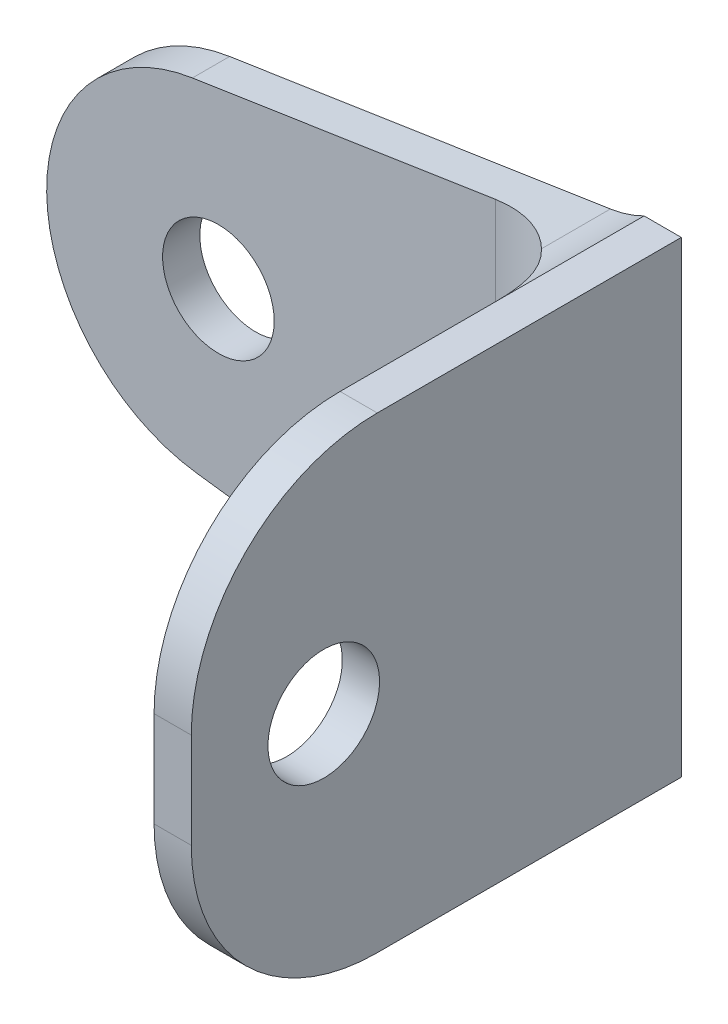
ISO-10303-21;
HEADER;
FILE_DESCRIPTION(('STEP AP214'),'2;1');
FILE_NAME('part.step','',(''),(''),'','','');
FILE_SCHEMA(('AUTOMOTIVE_DESIGN { 1 0 10303 214 1 1 1 1 }'));
ENDSEC;
DATA;
#1=APPLICATION_CONTEXT('core data for automotive mechanical design processes');
#2=APPLICATION_PROTOCOL_DEFINITION('international standard','automotive_design',2000,#1);
#3=PRODUCT_CONTEXT('',#1,'mechanical');
#4=PRODUCT('Part','Part','',(#3));
#5=PRODUCT_RELATED_PRODUCT_CATEGORY('part','',(#4));
#6=PRODUCT_DEFINITION_FORMATION('','',#4);
#7=PRODUCT_DEFINITION_CONTEXT('part definition',#1,'design');
#8=PRODUCT_DEFINITION('design','',#6,#7);
#9=PRODUCT_DEFINITION_SHAPE('','',#8);
#10=(LENGTH_UNIT() NAMED_UNIT(*) SI_UNIT(.MILLI.,.METRE.));
#11=(NAMED_UNIT(*) PLANE_ANGLE_UNIT() SI_UNIT($,.RADIAN.));
#12=(NAMED_UNIT(*) SI_UNIT($,.STERADIAN.) SOLID_ANGLE_UNIT());
#13=UNCERTAINTY_MEASURE_WITH_UNIT(LENGTH_MEASURE(1.E-05),#10,'distance_accuracy_value','');
#14=(GEOMETRIC_REPRESENTATION_CONTEXT(3) GLOBAL_UNCERTAINTY_ASSIGNED_CONTEXT((#13)) GLOBAL_UNIT_ASSIGNED_CONTEXT((#10,
#11,#12)) REPRESENTATION_CONTEXT('',''));
#15=CARTESIAN_POINT('',(0.,0.,0.));
#16=DIRECTION('',(0.,0.,1.));
#17=DIRECTION('',(1.,0.,0.));
#18=AXIS2_PLACEMENT_3D('',#15,#16,#17);
#19=CARTESIAN_POINT('',(274.999999999996,-59.9041243643724,2.));
#20=DIRECTION('',(0.151366741817184,-0.988477672722885,0.));
#21=DIRECTION('',(0.988477672722885,0.151366741817184,0.));
#22=AXIS2_PLACEMENT_3D('',#19,#20,#21);
#23=PLANE('',#22);
#24=CARTESIAN_POINT('',(266.999999999999,-61.1291737184983,8.));
#25=DIRECTION('',(0.151366741817184,-0.988477672722885,0.));
#26=DIRECTION('',(0.988477672722885,0.151366741817184,0.));
#27=AXIS2_PLACEMENT_3D('',#24,#25,#26);
#28=ELLIPSE('',#27,6.06993983331182,6.);
#29=CARTESIAN_POINT('',(266.999999999999,-61.1291737184983,2.));
#30=VERTEX_POINT('',#29);
#31=CARTESIAN_POINT('',(271.185710961045,-60.4882109048247,3.70118344767064));
#32=VERTEX_POINT('',#31);
#33=EDGE_CURVE('E58',#30,#32,#28,.T.);
#34=ORIENTED_EDGE('',*,*,#33,.T.);
#35=CARTESIAN_POINT('',(271.185710961045,-60.4882109048247,3.70118344767064));
#36=CARTESIAN_POINT('',(271.185710961045,-60.4882109048247,2.));
#37=B_SPLINE_CURVE_WITH_KNOTS('',1,(#35,#36),.UNSPECIFIED.,.F.,.F.,(2,2),(0.,1.),.UNSPECIFIED.);
#38=CARTESIAN_POINT('',(271.185710961045,-60.4882109048247,2.));
#39=VERTEX_POINT('',#38);
#40=EDGE_CURVE('E50',#32,#39,#37,.T.);
#41=ORIENTED_EDGE('',*,*,#40,.T.);
#42=DIRECTION('',(0.,0.,-1.));
#43=VECTOR('',#42,1.);
#44=CARTESIAN_POINT('',(271.185710961045,-60.4882109048247,2.00000000000002));
#45=LINE('',#44,#43);
#46=CARTESIAN_POINT('',(271.185710961045,-60.4882109048247,0.));
#47=VERTEX_POINT('',#46);
#48=EDGE_CURVE('E148',#39,#47,#45,.T.);
#49=ORIENTED_EDGE('',*,*,#48,.T.);
#50=DIRECTION('',(-0.988477672722884,-0.151366741817184,0.));
#51=VECTOR('',#50,1.);
#52=CARTESIAN_POINT('',(274.999999999996,-59.9041243643724,0.));
#53=LINE('',#52,#51);
#54=CARTESIAN_POINT('',(250.714866630847,-63.6229352329659,0.));
#55=VERTEX_POINT('',#54);
#56=EDGE_CURVE('E168',#47,#55,#53,.T.);
#57=ORIENTED_EDGE('',*,*,#56,.T.);
#58=DIRECTION('',(0.,0.,-1.));
#59=VECTOR('',#58,1.);
#60=CARTESIAN_POINT('',(250.714866630847,-63.6229352329659,2.));
#61=LINE('',#60,#59);
#62=CARTESIAN_POINT('',(250.714866630847,-63.6229352329659,2.));
#63=VERTEX_POINT('',#62);
#64=EDGE_CURVE('E191',#63,#55,#61,.T.);
#65=ORIENTED_EDGE('',*,*,#64,.F.);
#66=DIRECTION('',(-0.988477672722884,-0.151366741817184,0.));
#67=VECTOR('',#66,1.);
#68=CARTESIAN_POINT('',(274.999999999996,-59.9041243643724,2.));
#69=LINE('',#68,#67);
#70=EDGE_CURVE('E174',#30,#63,#69,.T.);
#71=ORIENTED_EDGE('',*,*,#70,.F.);
#72=EDGE_LOOP('',(#34,#41,#49,#57,#65,#71));
#73=FACE_BOUND('',#72,.T.);
#74=ADVANCED_FACE('F35',(#73),#23,.F.);
#75=CARTESIAN_POINT('',(250.920967809748,-81.9038233061181,2.));
#76=DIRECTION('',(0.129042640910157,0.991639045634515,0.));
#77=DIRECTION('',(-0.991639045634515,0.129042640910157,0.));
#78=AXIS2_PLACEMENT_3D('',#75,#76,#77);
#79=PLANE('',#78);
#80=DIRECTION('',(0.991639045634515,-0.129042640910157,0.));
#81=VECTOR('',#80,1.);
#82=CARTESIAN_POINT('',(250.920967809748,-81.9038233061181,0.));
#83=LINE('',#82,#81);
#84=CARTESIAN_POINT('',(250.920967809748,-81.9038233061181,0.));
#85=VERTEX_POINT('',#84);
#86=CARTESIAN_POINT('',(271.307050003365,-84.5566775837475,0.));
#87=VERTEX_POINT('',#86);
#88=EDGE_CURVE('E177',#85,#87,#83,.T.);
#89=ORIENTED_EDGE('',*,*,#88,.T.);
#90=DIRECTION('',(0.,0.,1.));
#91=VECTOR('',#90,1.);
#92=CARTESIAN_POINT('',(271.307050003365,-84.5566775837475,2.));
#93=LINE('',#92,#91);
#94=CARTESIAN_POINT('',(271.307050003365,-84.5566775837475,2.));
#95=VERTEX_POINT('',#94);
#96=EDGE_CURVE('E143',#87,#95,#93,.T.);
#97=ORIENTED_EDGE('',*,*,#96,.T.);
#98=CARTESIAN_POINT('',(271.307050003365,-84.5566775837475,2.));
#99=CARTESIAN_POINT('',(271.307050003365,-84.5566775837475,3.82276164571552));
#100=B_SPLINE_CURVE_WITH_KNOTS('',1,(#98,#99),.UNSPECIFIED.,.F.,.F.,(2,2),(0.,1.),.UNSPECIFIED.);
#101=CARTESIAN_POINT('',(271.307050003365,-84.5566775837475,3.82276164571552));
#102=VERTEX_POINT('',#101);
#103=EDGE_CURVE('E66',#95,#102,#100,.T.);
#104=ORIENTED_EDGE('',*,*,#103,.T.);
#105=CARTESIAN_POINT('',(266.999999999999,-83.9961983353625,8.));
#106=DIRECTION('',(0.129042640910157,0.991639045634515,0.));
#107=DIRECTION('',(-0.991639045634515,0.129042640910157,0.));
#108=AXIS2_PLACEMENT_3D('',#105,#106,#107);
#109=ELLIPSE('',#108,6.05058869597133,6.);
#110=CARTESIAN_POINT('',(266.999999999999,-83.9961983353625,2.));
#111=VERTEX_POINT('',#110);
#112=EDGE_CURVE('E247',#102,#111,#109,.T.);
#113=ORIENTED_EDGE('',*,*,#112,.T.);
#114=DIRECTION('',(0.991639045634515,-0.129042640910157,0.));
#115=VECTOR('',#114,1.);
#116=CARTESIAN_POINT('',(250.920967809748,-81.9038233061181,2.));
#117=LINE('',#116,#115);
#118=CARTESIAN_POINT('',(250.920967809748,-81.9038233061181,2.));
#119=VERTEX_POINT('',#118);
#120=EDGE_CURVE('E179',#119,#111,#117,.T.);
#121=ORIENTED_EDGE('',*,*,#120,.F.);
#122=DIRECTION('',(0.,0.,-1.));
#123=VECTOR('',#122,1.);
#124=CARTESIAN_POINT('',(250.920967809748,-81.9038233061181,2.));
#125=LINE('',#124,#123);
#126=EDGE_CURVE('E188',#119,#85,#125,.T.);
#127=ORIENTED_EDGE('',*,*,#126,.T.);
#128=EDGE_LOOP('',(#89,#97,#104,#113,#121,#127));
#129=FACE_BOUND('',#128,.T.);
#130=ADVANCED_FACE('F224',(#129),#79,.F.);
#131=CARTESIAN_POINT('',(252.112318831267,-72.7487860125337,2.));
#132=DIRECTION('',(0.,0.,1.));
#133=DIRECTION('',(1.,0.,0.));
#134=AXIS2_PLACEMENT_3D('',#131,#132,#133);
#135=PLANE('',#134);
#136=CARTESIAN_POINT('',(252.112318831267,-72.7487860125337,2.));
#137=DIRECTION('',(0.,0.,1.));
#138=DIRECTION('',(1.,0.,0.));
#139=AXIS2_PLACEMENT_3D('',#136,#137,#138);
#140=CIRCLE('',#139,2.99999999999999);
#141=CARTESIAN_POINT('',(255.112318831267,-72.7487860125337,2.));
#142=VERTEX_POINT('',#141);
#143=EDGE_CURVE('E337',#142,#142,#140,.T.);
#144=ORIENTED_EDGE('',*,*,#143,.F.);
#145=EDGE_LOOP('',(#144));
#146=FACE_BOUND('',#145,.T.);
#147=ORIENTED_EDGE('',*,*,#120,.T.);
#148=DIRECTION('',(0.,1.,0.));
#149=VECTOR('',#148,1.);
#150=CARTESIAN_POINT('',(266.999999999999,-72.7487860125337,2.));
#151=LINE('',#150,#149);
#152=EDGE_CURVE('E217',#111,#30,#151,.T.);
#153=ORIENTED_EDGE('',*,*,#152,.T.);
#154=ORIENTED_EDGE('',*,*,#70,.T.);
#155=CARTESIAN_POINT('',(252.112318831267,-72.7487860125337,2.));
#156=DIRECTION('',(0.,0.,1.));
#157=DIRECTION('',(1.,0.,0.));
#158=AXIS2_PLACEMENT_3D('',#155,#156,#157);
#159=CIRCLE('',#158,9.23222752662634);
#160=EDGE_CURVE('E176',#63,#119,#159,.T.);
#161=ORIENTED_EDGE('',*,*,#160,.T.);
#162=EDGE_LOOP('',(#147,#153,#154,#161));
#163=FACE_BOUND('',#162,.T.);
#164=ADVANCED_FACE('F234',(#146,#163),#135,.T.);
#165=CARTESIAN_POINT('',(274.999999999996,-85.0372435945478,2.));
#166=DIRECTION('',(-1.,0.,0.));
#167=DIRECTION('',(0.,0.,1.));
#168=AXIS2_PLACEMENT_3D('',#165,#166,#167);
#169=PLANE('',#168);
#170=CARTESIAN_POINT('',(274.999999999996,-72.4706839794601,19.2241169072921));
#171=DIRECTION('',(-1.,0.,0.));
#172=DIRECTION('',(0.,0.,1.));
#173=AXIS2_PLACEMENT_3D('',#170,#171,#172);
#174=CIRCLE('',#173,3.);
#175=CARTESIAN_POINT('',(274.999999999996,-72.4706839794601,22.2241169072921));
#176=VERTEX_POINT('',#175);
#177=EDGE_CURVE('E338',#176,#176,#174,.F.);
#178=ORIENTED_EDGE('',*,*,#177,.F.);
#179=EDGE_LOOP('',(#178));
#180=FACE_BOUND('',#179,.T.);
#181=DIRECTION('',(0.,0.,-1.));
#182=VECTOR('',#181,1.);
#183=CARTESIAN_POINT('',(274.999999999996,-59.9041243643724,2.));
#184=LINE('',#183,#182);
#185=CARTESIAN_POINT('',(274.999999999996,-59.9041243643724,16.3463061986581));
#186=VERTEX_POINT('',#185);
#187=CARTESIAN_POINT('',(274.999999999996,-59.9041243643724,0.));
#188=VERTEX_POINT('',#187);
#189=EDGE_CURVE('E194',#186,#188,#184,.T.);
#190=ORIENTED_EDGE('',*,*,#189,.F.);
#191=CARTESIAN_POINT('',(274.999999999996,-69.904124364372,16.3463061986584));
#192=DIRECTION('',(-1.,0.,0.));
#193=DIRECTION('',(0.,0.,1.));
#194=AXIS2_PLACEMENT_3D('',#191,#192,#193);
#195=CIRCLE('',#194,10.);
#196=CARTESIAN_POINT('',(274.999999999999,-69.904124364372,26.3463061986584));
#197=VERTEX_POINT('',#196);
#198=EDGE_CURVE('E201',#186,#197,#195,.F.);
#199=ORIENTED_EDGE('',*,*,#198,.T.);
#200=DIRECTION('',(0.,1.,0.));
#201=VECTOR('',#200,1.);
#202=CARTESIAN_POINT('',(274.999999999999,-59.9041243643724,26.3463061986584));
#203=LINE('',#202,#201);
#204=CARTESIAN_POINT('',(274.999999999999,-75.0372435945478,26.3463061986584));
#205=VERTEX_POINT('',#204);
#206=EDGE_CURVE('E300',#205,#197,#203,.T.);
#207=ORIENTED_EDGE('',*,*,#206,.F.);
#208=CARTESIAN_POINT('',(274.999999999996,-75.0372435945478,16.3463061986584));
#209=DIRECTION('',(-1.,0.,0.));
#210=DIRECTION('',(0.,0.,1.));
#211=AXIS2_PLACEMENT_3D('',#208,#209,#210);
#212=CIRCLE('',#211,10.);
#213=CARTESIAN_POINT('',(274.999999999996,-85.0372435945478,16.3463061986584));
#214=VERTEX_POINT('',#213);
#215=EDGE_CURVE('E199',#205,#214,#212,.F.);
#216=ORIENTED_EDGE('',*,*,#215,.T.);
#217=DIRECTION('',(0.,0.,-1.));
#218=VECTOR('',#217,1.);
#219=CARTESIAN_POINT('',(274.999999999996,-85.0372435945478,2.));
#220=LINE('',#219,#218);
#221=CARTESIAN_POINT('',(274.999999999996,-85.0372435945478,0.));
#222=VERTEX_POINT('',#221);
#223=EDGE_CURVE('E181',#214,#222,#220,.T.);
#224=ORIENTED_EDGE('',*,*,#223,.T.);
#225=DIRECTION('',(0.,1.,0.));
#226=VECTOR('',#225,1.);
#227=CARTESIAN_POINT('',(274.999999999996,-85.0372435945478,0.));
#228=LINE('',#227,#226);
#229=EDGE_CURVE('E165',#222,#188,#228,.T.);
#230=ORIENTED_EDGE('',*,*,#229,.T.);
#231=EDGE_LOOP('',(#190,#199,#207,#216,#224,#230));
#232=FACE_BOUND('',#231,.T.);
#233=ADVANCED_FACE('F239',(#180,#232),#169,.F.);
#234=CARTESIAN_POINT('',(252.112318831267,-72.7487860125337,2.));
#235=DIRECTION('',(0.,0.,-1.));
#236=DIRECTION('',(-1.,0.,0.));
#237=AXIS2_PLACEMENT_3D('',#234,#235,#236);
#238=CYLINDRICAL_SURFACE('',#237,9.23222752662634);
#239=CARTESIAN_POINT('',(252.112318831267,-72.7487860125337,0.));
#240=DIRECTION('',(0.,0.,1.));
#241=DIRECTION('',(1.,0.,0.));
#242=AXIS2_PLACEMENT_3D('',#239,#240,#241);
#243=CIRCLE('',#242,9.23222752662634);
#244=EDGE_CURVE('E184',#55,#85,#243,.T.);
#245=ORIENTED_EDGE('',*,*,#244,.T.);
#246=ORIENTED_EDGE('',*,*,#126,.F.);
#247=ORIENTED_EDGE('',*,*,#160,.F.);
#248=ORIENTED_EDGE('',*,*,#64,.T.);
#249=EDGE_LOOP('',(#245,#246,#247,#248));
#250=FACE_BOUND('',#249,.T.);
#251=ADVANCED_FACE('F236',(#250),#238,.T.);
#252=CARTESIAN_POINT('',(252.112318831267,-72.7487860125337,0.));
#253=DIRECTION('',(0.,0.,1.));
#254=DIRECTION('',(1.,0.,0.));
#255=AXIS2_PLACEMENT_3D('',#252,#253,#254);
#256=PLANE('',#255);
#257=CARTESIAN_POINT('',(252.112318831267,-72.7487860125337,0.));
#258=DIRECTION('',(0.,0.,1.));
#259=DIRECTION('',(1.,0.,0.));
#260=AXIS2_PLACEMENT_3D('',#257,#258,#259);
#261=CIRCLE('',#260,2.99999999999999);
#262=CARTESIAN_POINT('',(255.112318831267,-72.7487860125337,0.));
#263=VERTEX_POINT('',#262);
#264=EDGE_CURVE('E258',#263,#263,#261,.F.);
#265=ORIENTED_EDGE('',*,*,#264,.F.);
#266=EDGE_LOOP('',(#265));
#267=FACE_BOUND('',#266,.T.);
#268=ORIENTED_EDGE('',*,*,#229,.F.);
#269=DIRECTION('',(1.,0.,0.));
#270=VECTOR('',#269,1.);
#271=CARTESIAN_POINT('',(272.999999999999,-85.0372435945478,0.));
#272=LINE('',#271,#270);
#273=CARTESIAN_POINT('',(272.999999999999,-85.0372435945478,0.));
#274=VERTEX_POINT('',#273);
#275=EDGE_CURVE('E155',#274,#222,#272,.T.);
#276=ORIENTED_EDGE('',*,*,#275,.F.);
#277=CARTESIAN_POINT('',(270.532794157904,-90.5065118575546,0.));
#278=DIRECTION('',(0.,0.,1.));
#279=DIRECTION('',(1.,0.,0.));
#280=AXIS2_PLACEMENT_3D('',#277,#278,#279);
#281=CIRCLE('',#280,6.);
#282=EDGE_CURVE('E138',#274,#87,#281,.T.);
#283=ORIENTED_EDGE('',*,*,#282,.T.);
#284=ORIENTED_EDGE('',*,*,#88,.F.);
#285=ORIENTED_EDGE('',*,*,#244,.F.);
#286=ORIENTED_EDGE('',*,*,#56,.F.);
#287=CARTESIAN_POINT('',(270.277510510142,-54.5573448684874,0.));
#288=DIRECTION('',(0.,0.,1.));
#289=DIRECTION('',(1.,0.,0.));
#290=AXIS2_PLACEMENT_3D('',#287,#288,#289);
#291=CIRCLE('',#290,6.);
#292=CARTESIAN_POINT('',(272.999999999999,-59.9041243643724,0.));
#293=VERTEX_POINT('',#292);
#294=EDGE_CURVE('E11',#47,#293,#291,.T.);
#295=ORIENTED_EDGE('',*,*,#294,.T.);
#296=DIRECTION('',(1.,0.,0.));
#297=VECTOR('',#296,1.);
#298=CARTESIAN_POINT('',(272.999999999999,-59.9041243643724,0.));
#299=LINE('',#298,#297);
#300=EDGE_CURVE('E166',#293,#188,#299,.T.);
#301=ORIENTED_EDGE('',*,*,#300,.T.);
#302=EDGE_LOOP('',(#268,#276,#283,#284,#285,#286,#295,#301));
#303=FACE_BOUND('',#302,.T.);
#304=ADVANCED_FACE('F162',(#267,#303),#256,.F.);
#305=CARTESIAN_POINT('',(272.999999999999,0.,0.));
#306=DIRECTION('',(1.,0.,0.));
#307=DIRECTION('',(0.,0.,-1.));
#308=AXIS2_PLACEMENT_3D('',#305,#306,#307);
#309=PLANE('',#308);
#310=CARTESIAN_POINT('',(272.999999999999,-72.4706839794601,19.2241169072921));
#311=DIRECTION('',(-1.,0.,0.));
#312=DIRECTION('',(0.,0.,1.));
#313=AXIS2_PLACEMENT_3D('',#310,#311,#312);
#314=CIRCLE('',#313,3.);
#315=CARTESIAN_POINT('',(272.999999999999,-72.4706839794601,22.2241169072921));
#316=VERTEX_POINT('',#315);
#317=EDGE_CURVE('E343',#316,#316,#314,.T.);
#318=ORIENTED_EDGE('',*,*,#317,.F.);
#319=EDGE_LOOP('',(#318));
#320=FACE_BOUND('',#319,.T.);
#321=DIRECTION('',(0.,0.,-1.));
#322=VECTOR('',#321,1.);
#323=CARTESIAN_POINT('',(272.999999999999,-59.9041243643724,2.));
#324=LINE('',#323,#322);
#325=CARTESIAN_POINT('',(272.999999999999,-59.9041243643724,16.3463061986581));
#326=VERTEX_POINT('',#325);
#327=CARTESIAN_POINT('',(272.999999999999,-59.9041243643724,8.));
#328=VERTEX_POINT('',#327);
#329=EDGE_CURVE('E170',#326,#328,#324,.T.);
#330=ORIENTED_EDGE('',*,*,#329,.T.);
#331=DIRECTION('',(0.,1.,0.));
#332=VECTOR('',#331,1.);
#333=CARTESIAN_POINT('',(272.999999999999,0.,8.));
#334=LINE('',#333,#332);
#335=CARTESIAN_POINT('',(272.999999999999,-85.0372435945478,8.));
#336=VERTEX_POINT('',#335);
#337=EDGE_CURVE('E214',#328,#336,#334,.F.);
#338=ORIENTED_EDGE('',*,*,#337,.T.);
#339=DIRECTION('',(0.,0.,1.));
#340=VECTOR('',#339,1.);
#341=CARTESIAN_POINT('',(272.999999999999,-85.0372435945478,26.3463061986584));
#342=LINE('',#341,#340);
#343=CARTESIAN_POINT('',(272.999999999999,-85.0372435945478,16.3463061986584));
#344=VERTEX_POINT('',#343);
#345=EDGE_CURVE('E157',#336,#344,#342,.T.);
#346=ORIENTED_EDGE('',*,*,#345,.T.);
#347=CARTESIAN_POINT('',(272.999999999999,-75.0372435945478,16.3463061986584));
#348=DIRECTION('',(1.,0.,0.));
#349=DIRECTION('',(0.,0.,-1.));
#350=AXIS2_PLACEMENT_3D('',#347,#348,#349);
#351=CIRCLE('',#350,10.);
#352=CARTESIAN_POINT('',(272.999999999999,-75.0372435945478,26.3463061986584));
#353=VERTEX_POINT('',#352);
#354=EDGE_CURVE('E208',#344,#353,#351,.F.);
#355=ORIENTED_EDGE('',*,*,#354,.T.);
#356=DIRECTION('',(0.,1.,0.));
#357=VECTOR('',#356,1.);
#358=CARTESIAN_POINT('',(272.999999999999,-59.9041243643724,26.3463061986584));
#359=LINE('',#358,#357);
#360=CARTESIAN_POINT('',(272.999999999999,-69.904124364372,26.3463061986584));
#361=VERTEX_POINT('',#360);
#362=EDGE_CURVE('E159',#353,#361,#359,.T.);
#363=ORIENTED_EDGE('',*,*,#362,.T.);
#364=CARTESIAN_POINT('',(272.999999999999,-69.904124364372,16.3463061986584));
#365=DIRECTION('',(1.,0.,0.));
#366=DIRECTION('',(0.,0.,-1.));
#367=AXIS2_PLACEMENT_3D('',#364,#365,#366);
#368=CIRCLE('',#367,10.);
#369=EDGE_CURVE('E210',#361,#326,#368,.F.);
#370=ORIENTED_EDGE('',*,*,#369,.T.);
#371=EDGE_LOOP('',(#330,#338,#346,#355,#363,#370));
#372=FACE_BOUND('',#371,.T.);
#373=ADVANCED_FACE('F306',(#320,#372),#309,.F.);
#374=CARTESIAN_POINT('',(272.999999999999,-85.0372435945478,26.3463061986584));
#375=DIRECTION('',(0.,1.,0.));
#376=DIRECTION('',(0.,0.,1.));
#377=AXIS2_PLACEMENT_3D('',#374,#375,#376);
#378=PLANE('',#377);
#379=ORIENTED_EDGE('',*,*,#223,.F.);
#380=DIRECTION('',(1.,0.,0.));
#381=VECTOR('',#380,1.);
#382=CARTESIAN_POINT('',(272.999999999999,-85.0372435945478,16.3463061986584));
#383=LINE('',#382,#381);
#384=EDGE_CURVE('E212',#214,#344,#383,.F.);
#385=ORIENTED_EDGE('',*,*,#384,.T.);
#386=ORIENTED_EDGE('',*,*,#345,.F.);
#387=EDGE_CURVE('E142',#274,#336,#342,.T.);
#388=ORIENTED_EDGE('',*,*,#387,.F.);
#389=ORIENTED_EDGE('',*,*,#275,.T.);
#390=EDGE_LOOP('',(#379,#385,#386,#388,#389));
#391=FACE_BOUND('',#390,.T.);
#392=ADVANCED_FACE('F154',(#391),#378,.F.);
#393=CARTESIAN_POINT('',(272.999999999999,-59.9041243643724,26.3463061986584));
#394=DIRECTION('',(0.,0.,-1.));
#395=DIRECTION('',(0.,1.,0.));
#396=AXIS2_PLACEMENT_3D('',#393,#394,#395);
#397=PLANE('',#396);
#398=ORIENTED_EDGE('',*,*,#206,.T.);
#399=DIRECTION('',(1.,0.,0.));
#400=VECTOR('',#399,1.);
#401=CARTESIAN_POINT('',(272.999999999999,-69.904124364372,26.3463061986584));
#402=LINE('',#401,#400);
#403=EDGE_CURVE('E206',#197,#361,#402,.F.);
#404=ORIENTED_EDGE('',*,*,#403,.T.);
#405=ORIENTED_EDGE('',*,*,#362,.F.);
#406=DIRECTION('',(1.,0.,0.));
#407=VECTOR('',#406,1.);
#408=CARTESIAN_POINT('',(272.999999999999,-75.0372435945478,26.3463061986584));
#409=LINE('',#408,#407);
#410=EDGE_CURVE('E203',#353,#205,#409,.T.);
#411=ORIENTED_EDGE('',*,*,#410,.T.);
#412=EDGE_LOOP('',(#398,#404,#405,#411));
#413=FACE_BOUND('',#412,.T.);
#414=ADVANCED_FACE('F319',(#413),#397,.F.);
#415=CARTESIAN_POINT('',(272.999999999999,-59.9041243643724,0.));
#416=DIRECTION('',(0.,-1.,0.));
#417=DIRECTION('',(0.,0.,-1.));
#418=AXIS2_PLACEMENT_3D('',#415,#416,#417);
#419=PLANE('',#418);
#420=ORIENTED_EDGE('',*,*,#329,.F.);
#421=DIRECTION('',(1.,0.,0.));
#422=VECTOR('',#421,1.);
#423=CARTESIAN_POINT('',(272.999999999999,-59.904124364372,16.3463061986581));
#424=LINE('',#423,#422);
#425=EDGE_CURVE('E196',#326,#186,#424,.T.);
#426=ORIENTED_EDGE('',*,*,#425,.T.);
#427=ORIENTED_EDGE('',*,*,#189,.T.);
#428=ORIENTED_EDGE('',*,*,#300,.F.);
#429=EDGE_CURVE('E292',#328,#293,#324,.T.);
#430=ORIENTED_EDGE('',*,*,#429,.F.);
#431=EDGE_LOOP('',(#420,#426,#427,#428,#430));
#432=FACE_BOUND('',#431,.T.);
#433=ADVANCED_FACE('F309',(#432),#419,.F.);
#434=CARTESIAN_POINT('',(272.999999999999,-69.904124364372,16.3463061986584));
#435=DIRECTION('',(1.,0.,0.));
#436=DIRECTION('',(0.,0.,-1.));
#437=AXIS2_PLACEMENT_3D('',#434,#435,#436);
#438=CYLINDRICAL_SURFACE('',#437,10.);
#439=ORIENTED_EDGE('',*,*,#369,.F.);
#440=ORIENTED_EDGE('',*,*,#403,.F.);
#441=ORIENTED_EDGE('',*,*,#198,.F.);
#442=ORIENTED_EDGE('',*,*,#425,.F.);
#443=EDGE_LOOP('',(#439,#440,#441,#442));
#444=FACE_BOUND('',#443,.T.);
#445=ADVANCED_FACE('F312',(#444),#438,.T.);
#446=CARTESIAN_POINT('',(272.999999999999,-75.0372435945478,16.3463061986584));
#447=DIRECTION('',(1.,0.,0.));
#448=DIRECTION('',(0.,0.,-1.));
#449=AXIS2_PLACEMENT_3D('',#446,#447,#448);
#450=CYLINDRICAL_SURFACE('',#449,10.);
#451=ORIENTED_EDGE('',*,*,#354,.F.);
#452=ORIENTED_EDGE('',*,*,#384,.F.);
#453=ORIENTED_EDGE('',*,*,#215,.F.);
#454=ORIENTED_EDGE('',*,*,#410,.F.);
#455=EDGE_LOOP('',(#451,#452,#453,#454));
#456=FACE_BOUND('',#455,.T.);
#457=ADVANCED_FACE('F276',(#456),#450,.T.);
#458=CARTESIAN_POINT('',(270.277510510142,-54.5573448684874,1.67070185104649E-12));
#459=DIRECTION('',(0.,0.,-1.));
#460=DIRECTION('',(0.,1.,0.));
#461=AXIS2_PLACEMENT_3D('',#458,#459,#460);
#462=CYLINDRICAL_SURFACE('',#461,6.);
#463=ORIENTED_EDGE('',*,*,#48,.F.);
#464=ORIENTED_EDGE('',*,*,#40,.F.);
#465=CARTESIAN_POINT('',(271.185710961045,-60.4882109048247,3.70118344767064));
#466=CARTESIAN_POINT('',(271.307077092016,-60.4696251202195,3.81934730652606));
#467=CARTESIAN_POINT('',(271.423148342147,-60.4480396354115,3.94238430471244));
#468=CARTESIAN_POINT('',(271.644115634312,-60.4007301818852,4.19728974740231));
#469=CARTESIAN_POINT('',(271.749016560275,-60.3750080342651,4.32915429088004));
#470=CARTESIAN_POINT('',(271.94759161841,-60.321150968183,4.60148997818437));
#471=CARTESIAN_POINT('',(272.041215495021,-60.2930061430502,4.74199571730797));
#472=CARTESIAN_POINT('',(272.216263557097,-60.2362271469522,5.03031422172973));
#473=CARTESIAN_POINT('',(272.297687917737,-60.2075929830203,5.17812688206511));
#474=CARTESIAN_POINT('',(272.447929548041,-60.1516021426312,5.48036534512396));
#475=CARTESIAN_POINT('',(272.51674002719,-60.1242461601357,5.63479465496873));
#476=CARTESIAN_POINT('',(272.641195442764,-60.0725543220207,5.94927100872174));
#477=CARTESIAN_POINT('',(272.696847685907,-60.0482167938519,6.10931487791465));
#478=CARTESIAN_POINT('',(272.794386139038,-60.0041967987376,6.43358438410293));
#479=CARTESIAN_POINT('',(272.83631781963,-59.984499017525,6.59779422434116));
#480=CARTESIAN_POINT('',(272.906195789777,-59.9510003312781,6.92968193208134));
#481=CARTESIAN_POINT('',(272.934150428869,-59.9371959064214,7.09735766664735));
#482=CARTESIAN_POINT('',(272.969926908594,-59.9193574839575,7.38764972174313));
#483=CARTESIAN_POINT('',(272.981192973556,-59.9136706329857,7.50975120714105));
#484=CARTESIAN_POINT('',(272.996234301951,-59.9060417744893,7.75456144595878));
#485=CARTESIAN_POINT('',(273.00000764618,-59.9041007264273,7.87727034689677));
#486=CARTESIAN_POINT('',(272.999999999999,-59.9041243643722,7.99999999999998));
#487=B_SPLINE_CURVE_WITH_KNOTS('',3,(#465,#466,#467,#468,#469,#470,#471,#472,#473,#474,#475,
#476,#477,#478,#479,#480,#481,#482,#483,#484,#485,#486),.UNSPECIFIED.,.F.,.F.,(4,2,2,2,2,2,2,2,
2,2,4),(0.,0.510946608924026,1.02166889462449,1.53458900112562,2.04750174174872,2.5606897963944,
3.07359220686553,3.58477720038263,4.09565645874729,4.46363932870201,4.83171644253414),.UNSPECIFIED.);
#488=EDGE_CURVE('E40',#328,#32,#487,.F.);
#489=ORIENTED_EDGE('',*,*,#488,.F.);
#490=ORIENTED_EDGE('',*,*,#429,.T.);
#491=ORIENTED_EDGE('',*,*,#294,.F.);
#492=EDGE_LOOP('',(#463,#464,#489,#490,#491));
#493=FACE_BOUND('',#492,.T.);
#494=ADVANCED_FACE('F37',(#493),#462,.F.);
#495=CARTESIAN_POINT('',(266.999999999999,-72.7487860125337,8.));
#496=DIRECTION('',(0.,1.,0.));
#497=DIRECTION('',(0.,0.,1.));
#498=AXIS2_PLACEMENT_3D('',#495,#496,#497);
#499=CYLINDRICAL_SURFACE('',#498,6.);
#500=ORIENTED_EDGE('',*,*,#152,.F.);
#501=ORIENTED_EDGE('',*,*,#112,.F.);
#502=CARTESIAN_POINT('',(271.307050003365,-84.5566775837475,3.82276164571552));
#503=CARTESIAN_POINT('',(271.424642674542,-84.5719838862058,3.94399656631268));
#504=CARTESIAN_POINT('',(271.536884566479,-84.5901310674916,4.06998078620677));
#505=CARTESIAN_POINT('',(271.750076550608,-84.6302889115934,4.33052230707429));
#506=CARTESIAN_POINT('',(271.851030812899,-84.6522981398436,4.46507641296336));
#507=CARTESIAN_POINT('',(272.041518455751,-84.6984662777388,4.74246677835418));
#508=CARTESIAN_POINT('',(272.131005445227,-84.7226332872515,4.8853334776603));
#509=CARTESIAN_POINT('',(272.297638460005,-84.7712820811076,5.17805247917107));
#510=CARTESIAN_POINT('',(272.374783713236,-84.7957638850404,5.32790521764977));
#511=CARTESIAN_POINT('',(272.516301681604,-84.8433611096771,5.63381542060372));
#512=CARTESIAN_POINT('',(272.580669114035,-84.866475962484,5.78987541946018));
#513=CARTESIAN_POINT('',(272.696130905549,-84.9097467846738,6.10722544462));
#514=CARTESIAN_POINT('',(272.747226430616,-84.9299030139148,6.26851501008582));
#515=CARTESIAN_POINT('',(272.835552440039,-84.9657923579094,6.59472966537272));
#516=CARTESIAN_POINT('',(272.872830164362,-84.9815404968549,6.75964028805695));
#517=CARTESIAN_POINT('',(272.933360175321,-85.0075686475503,7.09236769747531));
#518=CARTESIAN_POINT('',(272.95662131705,-85.0178521111685,7.2601825803284));
#519=CARTESIAN_POINT('',(272.981821379692,-85.0290710873026,7.52365320638591));
#520=CARTESIAN_POINT('',(272.988636159509,-85.0321279061841,7.61877954347537));
#521=CARTESIAN_POINT('',(272.997725586764,-85.0362172456172,7.80926583695737));
#522=CARTESIAN_POINT('',(273.00000148061,-85.0372503219002,7.90462572201239));
#523=CARTESIAN_POINT('',(272.999999999999,-85.0372435945478,8.00000000000001));
#524=B_SPLINE_CURVE_WITH_KNOTS('',3,(#502,#503,#504,#505,#506,#507,#508,#509,#510,#511,#512,
#513,#514,#515,#516,#517,#518,#519,#520,#521,#522,#523),.UNSPECIFIED.,.F.,.F.,(4,2,2,2,2,2,2,2,
2,2,4),(0.,0.508509378984301,1.01683026934663,1.5271466879356,2.0374950182877,2.54805390342283,
3.05856791894334,3.56732014197451,4.07575061863124,4.36189119471291,4.64795318393025),.UNSPECIFIED.);
#525=EDGE_CURVE('E253',#336,#102,#524,.F.);
#526=ORIENTED_EDGE('',*,*,#525,.F.);
#527=ORIENTED_EDGE('',*,*,#337,.F.);
#528=ORIENTED_EDGE('',*,*,#488,.T.);
#529=ORIENTED_EDGE('',*,*,#33,.F.);
#530=EDGE_LOOP('',(#500,#501,#526,#527,#528,#529));
#531=FACE_BOUND('',#530,.T.);
#532=ADVANCED_FACE('F259',(#531),#499,.F.);
#533=CARTESIAN_POINT('',(270.532794157904,-90.5065118575546,0.));
#534=DIRECTION('',(0.,0.,1.));
#535=DIRECTION('',(0.,-1.,0.));
#536=AXIS2_PLACEMENT_3D('',#533,#534,#535);
#537=CYLINDRICAL_SURFACE('',#536,6.);
#538=ORIENTED_EDGE('',*,*,#103,.F.);
#539=ORIENTED_EDGE('',*,*,#96,.F.);
#540=ORIENTED_EDGE('',*,*,#282,.F.);
#541=ORIENTED_EDGE('',*,*,#387,.T.);
#542=ORIENTED_EDGE('',*,*,#525,.T.);
#543=EDGE_LOOP('',(#538,#539,#540,#541,#542));
#544=FACE_BOUND('',#543,.T.);
#545=ADVANCED_FACE('F140',(#544),#537,.F.);
#546=CARTESIAN_POINT('',(252.112318831267,-72.7487860125337,-0.00100000000000664));
#547=DIRECTION('',(0.,0.,1.));
#548=DIRECTION('',(1.,0.,0.));
#549=AXIS2_PLACEMENT_3D('',#546,#547,#548);
#550=CYLINDRICAL_SURFACE('',#549,2.99999999999999);
#551=ORIENTED_EDGE('',*,*,#143,.T.);
#552=EDGE_LOOP('',(#551));
#553=FACE_BOUND('',#552,.T.);
#554=ORIENTED_EDGE('',*,*,#264,.T.);
#555=EDGE_LOOP('',(#554));
#556=FACE_BOUND('',#555,.T.);
#557=ADVANCED_FACE('F264',(#553,#556),#550,.F.);
#558=CARTESIAN_POINT('',(275.000999999999,-72.4706839794601,19.2241169072921));
#559=DIRECTION('',(-1.,0.,0.));
#560=DIRECTION('',(0.,0.,1.));
#561=AXIS2_PLACEMENT_3D('',#558,#559,#560);
#562=CYLINDRICAL_SURFACE('',#561,3.);
#563=ORIENTED_EDGE('',*,*,#317,.T.);
#564=EDGE_LOOP('',(#563));
#565=FACE_BOUND('',#564,.T.);
#566=ORIENTED_EDGE('',*,*,#177,.T.);
#567=EDGE_LOOP('',(#566));
#568=FACE_BOUND('',#567,.T.);
#569=ADVANCED_FACE('F269',(#565,#568),#562,.F.);
#570=CLOSED_SHELL('',(#74,#130,#164,#233,#251,#304,#373,#392,#414,#433,#445,#457,#494,#532,#545,
#557,#569));
#571=MANIFOLD_SOLID_BREP('B2',#570);
#572=ADVANCED_BREP_SHAPE_REPRESENTATION('',(#18,#571),#14);
#573=SHAPE_DEFINITION_REPRESENTATION(#9,#572);
ENDSEC;
END-ISO-10303-21;
